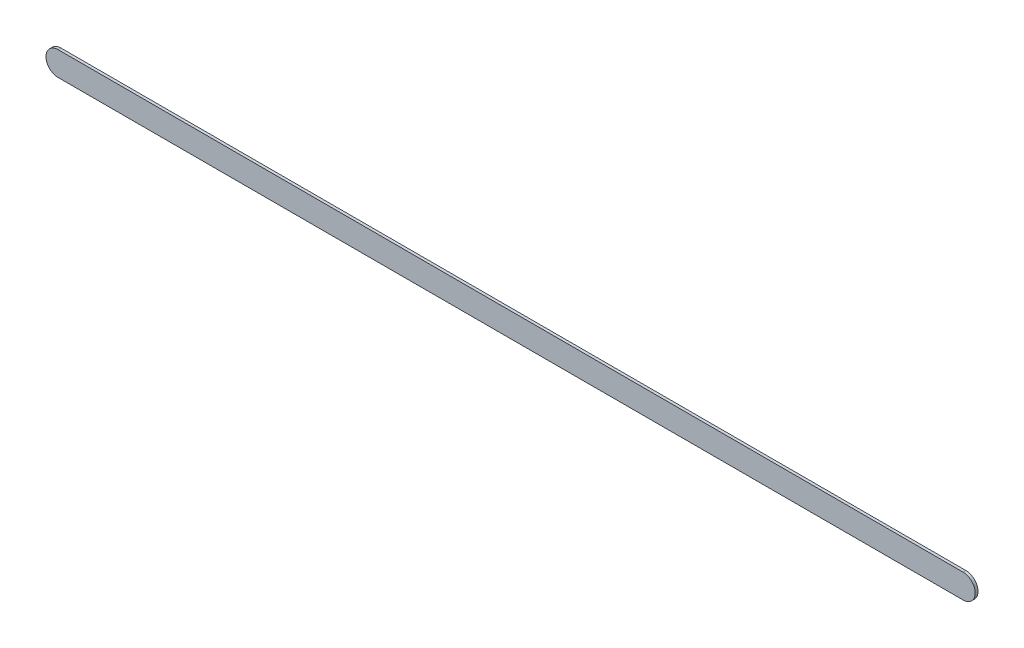
ISO-10303-21;
HEADER;
FILE_DESCRIPTION(('STEP AP214'),'2;1');
FILE_NAME('part.step','',(''),(''),'','','');
FILE_SCHEMA(('AUTOMOTIVE_DESIGN { 1 0 10303 214 1 1 1 1 }'));
ENDSEC;
DATA;
#1=APPLICATION_CONTEXT('core data for automotive mechanical design processes');
#2=APPLICATION_PROTOCOL_DEFINITION('international standard','automotive_design',2000,#1);
#3=PRODUCT_CONTEXT('',#1,'mechanical');
#4=PRODUCT('Part','Part','',(#3));
#5=PRODUCT_RELATED_PRODUCT_CATEGORY('part','',(#4));
#6=PRODUCT_DEFINITION_FORMATION('','',#4);
#7=PRODUCT_DEFINITION_CONTEXT('part definition',#1,'design');
#8=PRODUCT_DEFINITION('design','',#6,#7);
#9=PRODUCT_DEFINITION_SHAPE('','',#8);
#10=(LENGTH_UNIT() NAMED_UNIT(*) SI_UNIT(.MILLI.,.METRE.));
#11=(NAMED_UNIT(*) PLANE_ANGLE_UNIT() SI_UNIT($,.RADIAN.));
#12=(NAMED_UNIT(*) SI_UNIT($,.STERADIAN.) SOLID_ANGLE_UNIT());
#13=UNCERTAINTY_MEASURE_WITH_UNIT(LENGTH_MEASURE(1.E-05),#10,'distance_accuracy_value','');
#14=(GEOMETRIC_REPRESENTATION_CONTEXT(3) GLOBAL_UNCERTAINTY_ASSIGNED_CONTEXT((#13)) GLOBAL_UNIT_ASSIGNED_CONTEXT((#10,
#11,#12)) REPRESENTATION_CONTEXT('',''));
#15=CARTESIAN_POINT('',(0.,0.,0.));
#16=DIRECTION('',(0.,0.,1.));
#17=DIRECTION('',(1.,0.,0.));
#18=AXIS2_PLACEMENT_3D('',#15,#16,#17);
#19=CARTESIAN_POINT('',(93.49,-125.44,1.635));
#20=DIRECTION('',(0.,0.,1.));
#21=DIRECTION('',(1.,0.,0.));
#22=AXIS2_PLACEMENT_3D('',#19,#20,#21);
#23=PLANE('',#22);
#24=DIRECTION('',(-1.,0.,0.));
#25=VECTOR('',#24,1.);
#26=CARTESIAN_POINT('',(93.49,-125.44,1.635));
#27=LINE('',#26,#25);
#28=CARTESIAN_POINT('',(93.49,-125.44,1.635));
#29=VERTEX_POINT('',#28);
#30=CARTESIAN_POINT('',(82.24,-125.44,1.635));
#31=VERTEX_POINT('',#30);
#32=EDGE_CURVE('E92',#29,#31,#27,.T.);
#33=ORIENTED_EDGE('',*,*,#32,.T.);
#34=CARTESIAN_POINT('',(82.24,-125.59,1.635));
#35=DIRECTION('',(0.,0.,1.));
#36=DIRECTION('',(0.,1.,0.));
#37=AXIS2_PLACEMENT_3D('',#34,#35,#36);
#38=CIRCLE('',#37,0.15);
#39=CARTESIAN_POINT('',(82.24,-125.74,1.635));
#40=VERTEX_POINT('',#39);
#41=EDGE_CURVE('E69',#31,#40,#38,.T.);
#42=ORIENTED_EDGE('',*,*,#41,.T.);
#43=DIRECTION('',(1.,0.,0.));
#44=VECTOR('',#43,1.);
#45=CARTESIAN_POINT('',(82.24,-125.74,1.635));
#46=LINE('',#45,#44);
#47=CARTESIAN_POINT('',(93.49,-125.74,1.635));
#48=VERTEX_POINT('',#47);
#49=EDGE_CURVE('E85',#40,#48,#46,.T.);
#50=ORIENTED_EDGE('',*,*,#49,.T.);
#51=CARTESIAN_POINT('',(93.49,-125.59,1.635));
#52=DIRECTION('',(0.,0.,1.));
#53=DIRECTION('',(0.,-1.,0.));
#54=AXIS2_PLACEMENT_3D('',#51,#52,#53);
#55=CIRCLE('',#54,0.15);
#56=EDGE_CURVE('E11',#48,#29,#55,.T.);
#57=ORIENTED_EDGE('',*,*,#56,.T.);
#58=EDGE_LOOP('',(#33,#42,#50,#57));
#59=FACE_BOUND('',#58,.T.);
#60=ADVANCED_FACE('F17',(#59),#23,.T.);
#61=CARTESIAN_POINT('',(93.49,-125.44,1.6));
#62=DIRECTION('',(0.,0.,1.));
#63=DIRECTION('',(1.,0.,0.));
#64=AXIS2_PLACEMENT_3D('',#61,#62,#63);
#65=PLANE('',#64);
#66=CARTESIAN_POINT('',(93.49,-125.59,1.6));
#67=DIRECTION('',(0.,0.,1.));
#68=DIRECTION('',(0.,-1.,0.));
#69=AXIS2_PLACEMENT_3D('',#66,#67,#68);
#70=CIRCLE('',#69,0.15);
#71=CARTESIAN_POINT('',(93.49,-125.74,1.6));
#72=VERTEX_POINT('',#71);
#73=CARTESIAN_POINT('',(93.49,-125.44,1.6));
#74=VERTEX_POINT('',#73);
#75=EDGE_CURVE('E27',#72,#74,#70,.T.);
#76=ORIENTED_EDGE('',*,*,#75,.F.);
#77=DIRECTION('',(1.,0.,0.));
#78=VECTOR('',#77,1.);
#79=CARTESIAN_POINT('',(82.24,-125.74,1.6));
#80=LINE('',#79,#78);
#81=CARTESIAN_POINT('',(82.24,-125.74,1.6));
#82=VERTEX_POINT('',#81);
#83=EDGE_CURVE('E54',#82,#72,#80,.T.);
#84=ORIENTED_EDGE('',*,*,#83,.F.);
#85=CARTESIAN_POINT('',(82.24,-125.59,1.6));
#86=DIRECTION('',(0.,0.,1.));
#87=DIRECTION('',(0.,1.,0.));
#88=AXIS2_PLACEMENT_3D('',#85,#86,#87);
#89=CIRCLE('',#88,0.15);
#90=CARTESIAN_POINT('',(82.24,-125.44,1.6));
#91=VERTEX_POINT('',#90);
#92=EDGE_CURVE('E94',#91,#82,#89,.T.);
#93=ORIENTED_EDGE('',*,*,#92,.F.);
#94=DIRECTION('',(-1.,0.,0.));
#95=VECTOR('',#94,1.);
#96=CARTESIAN_POINT('',(93.49,-125.44,1.6));
#97=LINE('',#96,#95);
#98=EDGE_CURVE('E91',#74,#91,#97,.T.);
#99=ORIENTED_EDGE('',*,*,#98,.F.);
#100=EDGE_LOOP('',(#76,#84,#93,#99));
#101=FACE_BOUND('',#100,.T.);
#102=ADVANCED_FACE('F19',(#101),#65,.F.);
#103=CARTESIAN_POINT('',(93.49,-125.59,1.6));
#104=DIRECTION('',(0.,0.,-1.));
#105=DIRECTION('',(0.,-1.,0.));
#106=AXIS2_PLACEMENT_3D('',#103,#104,#105);
#107=CYLINDRICAL_SURFACE('',#106,0.15);
#108=ORIENTED_EDGE('',*,*,#75,.T.);
#109=DIRECTION('',(0.,0.,1.));
#110=VECTOR('',#109,1.);
#111=CARTESIAN_POINT('',(93.49,-125.44,1.6));
#112=LINE('',#111,#110);
#113=EDGE_CURVE('E79',#74,#29,#112,.T.);
#114=ORIENTED_EDGE('',*,*,#113,.T.);
#115=ORIENTED_EDGE('',*,*,#56,.F.);
#116=DIRECTION('',(0.,0.,1.));
#117=VECTOR('',#116,1.);
#118=CARTESIAN_POINT('',(93.49,-125.74,1.6));
#119=LINE('',#118,#117);
#120=EDGE_CURVE('E82',#72,#48,#119,.T.);
#121=ORIENTED_EDGE('',*,*,#120,.F.);
#122=EDGE_LOOP('',(#108,#114,#115,#121));
#123=FACE_BOUND('',#122,.T.);
#124=ADVANCED_FACE('F78',(#123),#107,.T.);
#125=CARTESIAN_POINT('',(82.24,-125.74,1.6));
#126=DIRECTION('',(0.,1.,0.));
#127=DIRECTION('',(1.,0.,0.));
#128=AXIS2_PLACEMENT_3D('',#125,#126,#127);
#129=PLANE('',#128);
#130=ORIENTED_EDGE('',*,*,#83,.T.);
#131=ORIENTED_EDGE('',*,*,#120,.T.);
#132=ORIENTED_EDGE('',*,*,#49,.F.);
#133=DIRECTION('',(0.,0.,1.));
#134=VECTOR('',#133,1.);
#135=CARTESIAN_POINT('',(82.24,-125.74,1.6));
#136=LINE('',#135,#134);
#137=EDGE_CURVE('E114',#82,#40,#136,.T.);
#138=ORIENTED_EDGE('',*,*,#137,.F.);
#139=EDGE_LOOP('',(#130,#131,#132,#138));
#140=FACE_BOUND('',#139,.T.);
#141=ADVANCED_FACE('F122',(#140),#129,.F.);
#142=CARTESIAN_POINT('',(82.24,-125.59,1.6));
#143=DIRECTION('',(0.,0.,-1.));
#144=DIRECTION('',(0.,1.,0.));
#145=AXIS2_PLACEMENT_3D('',#142,#143,#144);
#146=CYLINDRICAL_SURFACE('',#145,0.15);
#147=ORIENTED_EDGE('',*,*,#92,.T.);
#148=ORIENTED_EDGE('',*,*,#137,.T.);
#149=ORIENTED_EDGE('',*,*,#41,.F.);
#150=DIRECTION('',(0.,0.,1.));
#151=VECTOR('',#150,1.);
#152=CARTESIAN_POINT('',(82.24,-125.44,1.6));
#153=LINE('',#152,#151);
#154=EDGE_CURVE('E98',#91,#31,#153,.T.);
#155=ORIENTED_EDGE('',*,*,#154,.F.);
#156=EDGE_LOOP('',(#147,#148,#149,#155));
#157=FACE_BOUND('',#156,.T.);
#158=ADVANCED_FACE('F123',(#157),#146,.T.);
#159=CARTESIAN_POINT('',(93.49,-125.44,1.6));
#160=DIRECTION('',(0.,-1.,0.));
#161=DIRECTION('',(0.,0.,-1.));
#162=AXIS2_PLACEMENT_3D('',#159,#160,#161);
#163=PLANE('',#162);
#164=ORIENTED_EDGE('',*,*,#98,.T.);
#165=ORIENTED_EDGE('',*,*,#154,.T.);
#166=ORIENTED_EDGE('',*,*,#32,.F.);
#167=ORIENTED_EDGE('',*,*,#113,.F.);
#168=EDGE_LOOP('',(#164,#165,#166,#167));
#169=FACE_BOUND('',#168,.T.);
#170=ADVANCED_FACE('F89',(#169),#163,.F.);
#171=CLOSED_SHELL('',(#60,#102,#124,#141,#158,#170));
#172=MANIFOLD_SOLID_BREP('B1',#171);
#173=ADVANCED_BREP_SHAPE_REPRESENTATION('',(#18,#172),#14);
#174=SHAPE_DEFINITION_REPRESENTATION(#9,#173);
ENDSEC;
END-ISO-10303-21;
